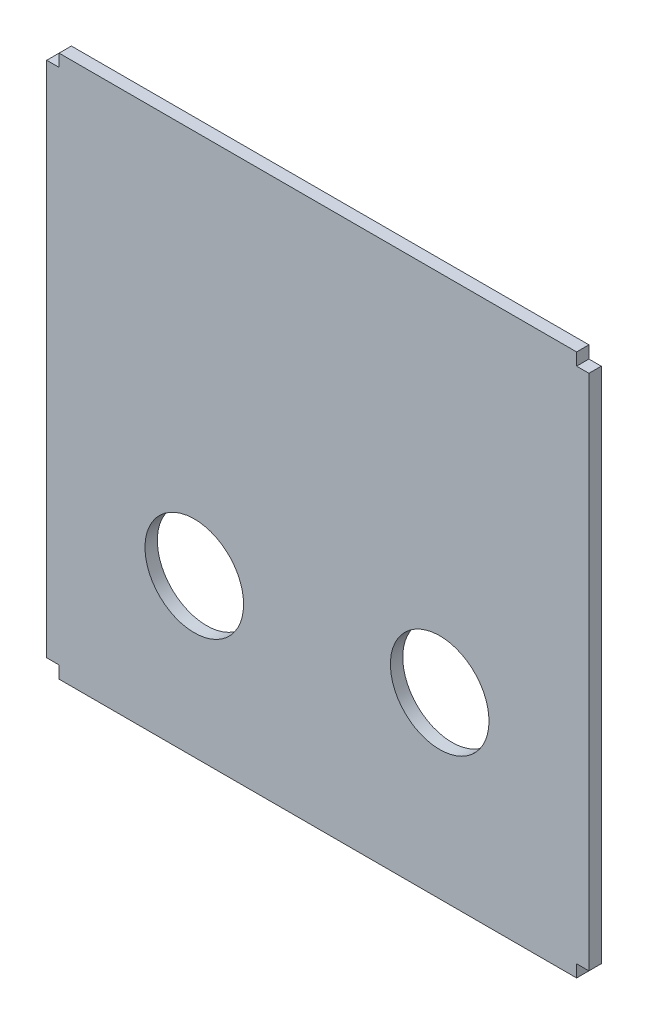
ISO-10303-21;
HEADER;
FILE_DESCRIPTION(('STEP AP214'),'2;1');
FILE_NAME('part.step','',(''),(''),'','','');
FILE_SCHEMA(('AUTOMOTIVE_DESIGN { 1 0 10303 214 1 1 1 1 }'));
ENDSEC;
DATA;
#1=APPLICATION_CONTEXT('core data for automotive mechanical design processes');
#2=APPLICATION_PROTOCOL_DEFINITION('international standard','automotive_design',2000,#1);
#3=PRODUCT_CONTEXT('',#1,'mechanical');
#4=PRODUCT('Part','Part','',(#3));
#5=PRODUCT_RELATED_PRODUCT_CATEGORY('part','',(#4));
#6=PRODUCT_DEFINITION_FORMATION('','',#4);
#7=PRODUCT_DEFINITION_CONTEXT('part definition',#1,'design');
#8=PRODUCT_DEFINITION('design','',#6,#7);
#9=PRODUCT_DEFINITION_SHAPE('','',#8);
#10=(LENGTH_UNIT() NAMED_UNIT(*) SI_UNIT(.MILLI.,.METRE.));
#11=(NAMED_UNIT(*) PLANE_ANGLE_UNIT() SI_UNIT($,.RADIAN.));
#12=(NAMED_UNIT(*) SI_UNIT($,.STERADIAN.) SOLID_ANGLE_UNIT());
#13=UNCERTAINTY_MEASURE_WITH_UNIT(LENGTH_MEASURE(1.E-05),#10,'distance_accuracy_value','');
#14=(GEOMETRIC_REPRESENTATION_CONTEXT(3) GLOBAL_UNCERTAINTY_ASSIGNED_CONTEXT((#13)) GLOBAL_UNIT_ASSIGNED_CONTEXT((#10,
#11,#12)) REPRESENTATION_CONTEXT('',''));
#15=CARTESIAN_POINT('',(0.,0.,0.));
#16=DIRECTION('',(0.,0.,1.));
#17=DIRECTION('',(1.,0.,0.));
#18=AXIS2_PLACEMENT_3D('',#15,#16,#17);
#19=CARTESIAN_POINT('',(139.7,-139.7,6.35));
#20=DIRECTION('',(-1.,0.,0.));
#21=DIRECTION('',(0.,0.,1.));
#22=AXIS2_PLACEMENT_3D('',#19,#20,#21);
#23=PLANE('',#22);
#24=DIRECTION('',(0.,1.,0.));
#25=VECTOR('',#24,1.);
#26=CARTESIAN_POINT('',(139.7,-139.7,6.35));
#27=LINE('',#26,#25);
#28=CARTESIAN_POINT('',(139.7,-133.35,6.35));
#29=VERTEX_POINT('',#28);
#30=CARTESIAN_POINT('',(139.7,133.35,6.35));
#31=VERTEX_POINT('',#30);
#32=EDGE_CURVE('E161',#29,#31,#27,.T.);
#33=ORIENTED_EDGE('',*,*,#32,.F.);
#34=DIRECTION('',(0.,0.,1.));
#35=VECTOR('',#34,1.);
#36=CARTESIAN_POINT('',(139.7,-133.35,0.));
#37=LINE('',#36,#35);
#38=CARTESIAN_POINT('',(139.7,-133.35,0.));
#39=VERTEX_POINT('',#38);
#40=EDGE_CURVE('E207',#39,#29,#37,.T.);
#41=ORIENTED_EDGE('',*,*,#40,.F.);
#42=DIRECTION('',(0.,1.,0.));
#43=VECTOR('',#42,1.);
#44=CARTESIAN_POINT('',(139.7,-139.7,0.));
#45=LINE('',#44,#43);
#46=CARTESIAN_POINT('',(139.7,133.35,0.));
#47=VERTEX_POINT('',#46);
#48=EDGE_CURVE('E151',#39,#47,#45,.T.);
#49=ORIENTED_EDGE('',*,*,#48,.T.);
#50=DIRECTION('',(0.,0.,1.));
#51=VECTOR('',#50,1.);
#52=CARTESIAN_POINT('',(139.7,133.35,0.));
#53=LINE('',#52,#51);
#54=EDGE_CURVE('E187',#47,#31,#53,.T.);
#55=ORIENTED_EDGE('',*,*,#54,.T.);
#56=EDGE_LOOP('',(#33,#41,#49,#55));
#57=FACE_BOUND('',#56,.T.);
#58=ADVANCED_FACE('F33',(#57),#23,.F.);
#59=CARTESIAN_POINT('',(-139.7,139.7,6.35));
#60=DIRECTION('',(0.,-1.,0.));
#61=DIRECTION('',(0.,0.,-1.));
#62=AXIS2_PLACEMENT_3D('',#59,#60,#61);
#63=PLANE('',#62);
#64=DIRECTION('',(-1.,0.,0.));
#65=VECTOR('',#64,1.);
#66=CARTESIAN_POINT('',(-139.7,139.7,6.35));
#67=LINE('',#66,#65);
#68=CARTESIAN_POINT('',(133.35,139.7,6.35));
#69=VERTEX_POINT('',#68);
#70=CARTESIAN_POINT('',(-133.35,139.7,6.35));
#71=VERTEX_POINT('',#70);
#72=EDGE_CURVE('E143',#69,#71,#67,.T.);
#73=ORIENTED_EDGE('',*,*,#72,.F.);
#74=DIRECTION('',(0.,0.,1.));
#75=VECTOR('',#74,1.);
#76=CARTESIAN_POINT('',(133.35,139.7,0.));
#77=LINE('',#76,#75);
#78=CARTESIAN_POINT('',(133.35,139.7,0.));
#79=VERTEX_POINT('',#78);
#80=EDGE_CURVE('E127',#79,#69,#77,.T.);
#81=ORIENTED_EDGE('',*,*,#80,.F.);
#82=DIRECTION('',(-1.,0.,0.));
#83=VECTOR('',#82,1.);
#84=CARTESIAN_POINT('',(-139.7,139.7,0.));
#85=LINE('',#84,#83);
#86=CARTESIAN_POINT('',(-133.35,139.7,0.));
#87=VERTEX_POINT('',#86);
#88=EDGE_CURVE('E141',#79,#87,#85,.T.);
#89=ORIENTED_EDGE('',*,*,#88,.T.);
#90=DIRECTION('',(0.,0.,1.));
#91=VECTOR('',#90,1.);
#92=CARTESIAN_POINT('',(-133.35,139.7,0.));
#93=LINE('',#92,#91);
#94=EDGE_CURVE('E168',#87,#71,#93,.T.);
#95=ORIENTED_EDGE('',*,*,#94,.T.);
#96=EDGE_LOOP('',(#73,#81,#89,#95));
#97=FACE_BOUND('',#96,.T.);
#98=ADVANCED_FACE('F139',(#97),#63,.F.);
#99=CARTESIAN_POINT('',(-139.7,-139.7,6.35));
#100=DIRECTION('',(1.,0.,0.));
#101=DIRECTION('',(0.,0.,-1.));
#102=AXIS2_PLACEMENT_3D('',#99,#100,#101);
#103=PLANE('',#102);
#104=DIRECTION('',(0.,-1.,0.));
#105=VECTOR('',#104,1.);
#106=CARTESIAN_POINT('',(-139.7,-139.7,0.));
#107=LINE('',#106,#105);
#108=CARTESIAN_POINT('',(-139.7,133.35,0.));
#109=VERTEX_POINT('',#108);
#110=CARTESIAN_POINT('',(-139.7,-133.35,0.));
#111=VERTEX_POINT('',#110);
#112=EDGE_CURVE('E150',#109,#111,#107,.T.);
#113=ORIENTED_EDGE('',*,*,#112,.T.);
#114=DIRECTION('',(0.,0.,1.));
#115=VECTOR('',#114,1.);
#116=CARTESIAN_POINT('',(-139.7,-133.35,0.));
#117=LINE('',#116,#115);
#118=CARTESIAN_POINT('',(-139.7,-133.35,6.35));
#119=VERTEX_POINT('',#118);
#120=EDGE_CURVE('E194',#111,#119,#117,.T.);
#121=ORIENTED_EDGE('',*,*,#120,.T.);
#122=DIRECTION('',(0.,-1.,0.));
#123=VECTOR('',#122,1.);
#124=CARTESIAN_POINT('',(-139.7,-139.7,6.35));
#125=LINE('',#124,#123);
#126=CARTESIAN_POINT('',(-139.7,133.35,6.35));
#127=VERTEX_POINT('',#126);
#128=EDGE_CURVE('E41',#127,#119,#125,.T.);
#129=ORIENTED_EDGE('',*,*,#128,.F.);
#130=DIRECTION('',(0.,0.,1.));
#131=VECTOR('',#130,1.);
#132=CARTESIAN_POINT('',(-139.7,133.35,0.));
#133=LINE('',#132,#131);
#134=EDGE_CURVE('E176',#109,#127,#133,.T.);
#135=ORIENTED_EDGE('',*,*,#134,.F.);
#136=EDGE_LOOP('',(#113,#121,#129,#135));
#137=FACE_BOUND('',#136,.T.);
#138=ADVANCED_FACE('F255',(#137),#103,.F.);
#139=CARTESIAN_POINT('',(-139.7,-139.7,6.35));
#140=DIRECTION('',(0.,1.,0.));
#141=DIRECTION('',(0.,0.,1.));
#142=AXIS2_PLACEMENT_3D('',#139,#140,#141);
#143=PLANE('',#142);
#144=DIRECTION('',(1.,0.,0.));
#145=VECTOR('',#144,1.);
#146=CARTESIAN_POINT('',(-139.7,-139.7,6.35));
#147=LINE('',#146,#145);
#148=CARTESIAN_POINT('',(-133.35,-139.7,6.35));
#149=VERTEX_POINT('',#148);
#150=CARTESIAN_POINT('',(133.35,-139.7,6.35));
#151=VERTEX_POINT('',#150);
#152=EDGE_CURVE('E11',#149,#151,#147,.T.);
#153=ORIENTED_EDGE('',*,*,#152,.F.);
#154=DIRECTION('',(0.,0.,1.));
#155=VECTOR('',#154,1.);
#156=CARTESIAN_POINT('',(-133.35,-139.7,0.));
#157=LINE('',#156,#155);
#158=CARTESIAN_POINT('',(-133.35,-139.7,0.));
#159=VERTEX_POINT('',#158);
#160=EDGE_CURVE('E190',#159,#149,#157,.T.);
#161=ORIENTED_EDGE('',*,*,#160,.F.);
#162=DIRECTION('',(1.,0.,0.));
#163=VECTOR('',#162,1.);
#164=CARTESIAN_POINT('',(-139.7,-139.7,0.));
#165=LINE('',#164,#163);
#166=CARTESIAN_POINT('',(133.35,-139.7,0.));
#167=VERTEX_POINT('',#166);
#168=EDGE_CURVE('E36',#159,#167,#165,.T.);
#169=ORIENTED_EDGE('',*,*,#168,.T.);
#170=DIRECTION('',(0.,0.,1.));
#171=VECTOR('',#170,1.);
#172=CARTESIAN_POINT('',(133.35,-139.7,0.));
#173=LINE('',#172,#171);
#174=EDGE_CURVE('E211',#167,#151,#173,.T.);
#175=ORIENTED_EDGE('',*,*,#174,.T.);
#176=EDGE_LOOP('',(#153,#161,#169,#175));
#177=FACE_BOUND('',#176,.T.);
#178=ADVANCED_FACE('F245',(#177),#143,.F.);
#179=CARTESIAN_POINT('',(0.,0.,6.35));
#180=DIRECTION('',(0.,0.,-1.));
#181=DIRECTION('',(-1.,0.,0.));
#182=AXIS2_PLACEMENT_3D('',#179,#180,#181);
#183=PLANE('',#182);
#184=CARTESIAN_POINT('',(-63.6689867874865,-58.7375000000001,6.35));
#185=DIRECTION('',(0.,0.,1.));
#186=DIRECTION('',(1.,0.,0.));
#187=AXIS2_PLACEMENT_3D('',#184,#185,#186);
#188=CIRCLE('',#187,25.4);
#189=CARTESIAN_POINT('',(-38.2689867874865,-58.7375000000001,6.35));
#190=VERTEX_POINT('',#189);
#191=EDGE_CURVE('E171',#190,#190,#188,.T.);
#192=ORIENTED_EDGE('',*,*,#191,.F.);
#193=EDGE_LOOP('',(#192));
#194=FACE_BOUND('',#193,.T.);
#195=CARTESIAN_POINT('',(62.7972915434112,-47.6249999999954,6.35));
#196=DIRECTION('',(0.,0.,1.));
#197=DIRECTION('',(1.,0.,0.));
#198=AXIS2_PLACEMENT_3D('',#195,#196,#197);
#199=CIRCLE('',#198,25.4000000000008);
#200=CARTESIAN_POINT('',(88.197291543412,-47.6249999999954,6.35));
#201=VERTEX_POINT('',#200);
#202=EDGE_CURVE('E164',#201,#201,#199,.T.);
#203=ORIENTED_EDGE('',*,*,#202,.F.);
#204=EDGE_LOOP('',(#203));
#205=FACE_BOUND('',#204,.T.);
#206=ORIENTED_EDGE('',*,*,#128,.T.);
#207=DIRECTION('',(-1.,0.,0.));
#208=VECTOR('',#207,1.);
#209=CARTESIAN_POINT('',(-139.7,-133.35,6.35));
#210=LINE('',#209,#208);
#211=CARTESIAN_POINT('',(-133.35,-133.35,6.35));
#212=VERTEX_POINT('',#211);
#213=EDGE_CURVE('E198',#212,#119,#210,.T.);
#214=ORIENTED_EDGE('',*,*,#213,.F.);
#215=DIRECTION('',(0.,1.,0.));
#216=VECTOR('',#215,1.);
#217=CARTESIAN_POINT('',(-133.35,-139.7,6.35));
#218=LINE('',#217,#216);
#219=EDGE_CURVE('E201',#149,#212,#218,.T.);
#220=ORIENTED_EDGE('',*,*,#219,.F.);
#221=ORIENTED_EDGE('',*,*,#152,.T.);
#222=DIRECTION('',(0.,-1.,0.));
#223=VECTOR('',#222,1.);
#224=CARTESIAN_POINT('',(133.35,-139.7,6.35));
#225=LINE('',#224,#223);
#226=CARTESIAN_POINT('',(133.35,-133.35,6.35));
#227=VERTEX_POINT('',#226);
#228=EDGE_CURVE('E215',#227,#151,#225,.T.);
#229=ORIENTED_EDGE('',*,*,#228,.F.);
#230=DIRECTION('',(-1.,0.,0.));
#231=VECTOR('',#230,1.);
#232=CARTESIAN_POINT('',(139.7,-133.35,6.35));
#233=LINE('',#232,#231);
#234=EDGE_CURVE('E197',#29,#227,#233,.T.);
#235=ORIENTED_EDGE('',*,*,#234,.F.);
#236=ORIENTED_EDGE('',*,*,#32,.T.);
#237=DIRECTION('',(1.,0.,0.));
#238=VECTOR('',#237,1.);
#239=CARTESIAN_POINT('',(139.7,133.35,6.35));
#240=LINE('',#239,#238);
#241=CARTESIAN_POINT('',(133.35,133.35,6.35));
#242=VERTEX_POINT('',#241);
#243=EDGE_CURVE('E134',#242,#31,#240,.T.);
#244=ORIENTED_EDGE('',*,*,#243,.F.);
#245=DIRECTION('',(0.,-1.,0.));
#246=VECTOR('',#245,1.);
#247=CARTESIAN_POINT('',(133.35,139.7,6.35));
#248=LINE('',#247,#246);
#249=EDGE_CURVE('E214',#69,#242,#248,.T.);
#250=ORIENTED_EDGE('',*,*,#249,.F.);
#251=ORIENTED_EDGE('',*,*,#72,.T.);
#252=DIRECTION('',(0.,1.,0.));
#253=VECTOR('',#252,1.);
#254=CARTESIAN_POINT('',(-133.35,139.7,6.35));
#255=LINE('',#254,#253);
#256=CARTESIAN_POINT('',(-133.35,133.35,6.35));
#257=VERTEX_POINT('',#256);
#258=EDGE_CURVE('E181',#257,#71,#255,.T.);
#259=ORIENTED_EDGE('',*,*,#258,.F.);
#260=DIRECTION('',(1.,0.,0.));
#261=VECTOR('',#260,1.);
#262=CARTESIAN_POINT('',(-139.7,133.35,6.35));
#263=LINE('',#262,#261);
#264=EDGE_CURVE('E184',#127,#257,#263,.T.);
#265=ORIENTED_EDGE('',*,*,#264,.F.);
#266=EDGE_LOOP('',(#206,#214,#220,#221,#229,#235,#236,#244,#250,#251,#259,#265));
#267=FACE_BOUND('',#266,.T.);
#268=ADVANCED_FACE('F238',(#194,#205,#267),#183,.F.);
#269=CARTESIAN_POINT('',(0.,0.,0.));
#270=DIRECTION('',(0.,0.,-1.));
#271=DIRECTION('',(-1.,0.,0.));
#272=AXIS2_PLACEMENT_3D('',#269,#270,#271);
#273=PLANE('',#272);
#274=DIRECTION('',(-1.,0.,0.));
#275=VECTOR('',#274,1.);
#276=CARTESIAN_POINT('',(-139.7,-133.35,0.));
#277=LINE('',#276,#275);
#278=CARTESIAN_POINT('',(-133.35,-133.35,0.));
#279=VERTEX_POINT('',#278);
#280=EDGE_CURVE('E49',#279,#111,#277,.T.);
#281=ORIENTED_EDGE('',*,*,#280,.T.);
#282=ORIENTED_EDGE('',*,*,#112,.F.);
#283=DIRECTION('',(1.,0.,0.));
#284=VECTOR('',#283,1.);
#285=CARTESIAN_POINT('',(-139.7,133.35,0.));
#286=LINE('',#285,#284);
#287=CARTESIAN_POINT('',(-133.35,133.35,0.));
#288=VERTEX_POINT('',#287);
#289=EDGE_CURVE('E183',#109,#288,#286,.T.);
#290=ORIENTED_EDGE('',*,*,#289,.T.);
#291=DIRECTION('',(0.,1.,0.));
#292=VECTOR('',#291,1.);
#293=CARTESIAN_POINT('',(-133.35,139.7,0.));
#294=LINE('',#293,#292);
#295=EDGE_CURVE('E149',#288,#87,#294,.T.);
#296=ORIENTED_EDGE('',*,*,#295,.T.);
#297=ORIENTED_EDGE('',*,*,#88,.F.);
#298=DIRECTION('',(0.,-1.,0.));
#299=VECTOR('',#298,1.);
#300=CARTESIAN_POINT('',(133.35,139.7,0.));
#301=LINE('',#300,#299);
#302=CARTESIAN_POINT('',(133.35,133.35,0.));
#303=VERTEX_POINT('',#302);
#304=EDGE_CURVE('E123',#79,#303,#301,.T.);
#305=ORIENTED_EDGE('',*,*,#304,.T.);
#306=DIRECTION('',(1.,0.,0.));
#307=VECTOR('',#306,1.);
#308=CARTESIAN_POINT('',(139.7,133.35,0.));
#309=LINE('',#308,#307);
#310=EDGE_CURVE('E133',#303,#47,#309,.T.);
#311=ORIENTED_EDGE('',*,*,#310,.T.);
#312=ORIENTED_EDGE('',*,*,#48,.F.);
#313=DIRECTION('',(-1.,0.,0.));
#314=VECTOR('',#313,1.);
#315=CARTESIAN_POINT('',(139.7,-133.35,0.));
#316=LINE('',#315,#314);
#317=CARTESIAN_POINT('',(133.35,-133.35,0.));
#318=VERTEX_POINT('',#317);
#319=EDGE_CURVE('E217',#39,#318,#316,.T.);
#320=ORIENTED_EDGE('',*,*,#319,.T.);
#321=DIRECTION('',(0.,-1.,0.));
#322=VECTOR('',#321,1.);
#323=CARTESIAN_POINT('',(133.35,-139.7,0.));
#324=LINE('',#323,#322);
#325=EDGE_CURVE('E57',#318,#167,#324,.T.);
#326=ORIENTED_EDGE('',*,*,#325,.T.);
#327=ORIENTED_EDGE('',*,*,#168,.F.);
#328=DIRECTION('',(0.,1.,0.));
#329=VECTOR('',#328,1.);
#330=CARTESIAN_POINT('',(-133.35,-139.7,0.));
#331=LINE('',#330,#329);
#332=EDGE_CURVE('E200',#159,#279,#331,.T.);
#333=ORIENTED_EDGE('',*,*,#332,.T.);
#334=EDGE_LOOP('',(#281,#282,#290,#296,#297,#305,#311,#312,#320,#326,#327,#333));
#335=FACE_BOUND('',#334,.T.);
#336=CARTESIAN_POINT('',(-63.6689867874865,-58.7375000000001,0.));
#337=DIRECTION('',(0.,0.,1.));
#338=DIRECTION('',(1.,0.,0.));
#339=AXIS2_PLACEMENT_3D('',#336,#337,#338);
#340=CIRCLE('',#339,25.4);
#341=CARTESIAN_POINT('',(-38.2689867874865,-58.7375000000001,0.));
#342=VERTEX_POINT('',#341);
#343=EDGE_CURVE('E155',#342,#342,#340,.T.);
#344=ORIENTED_EDGE('',*,*,#343,.T.);
#345=EDGE_LOOP('',(#344));
#346=FACE_BOUND('',#345,.T.);
#347=CARTESIAN_POINT('',(62.7972915434112,-47.6249999999954,0.));
#348=DIRECTION('',(0.,0.,1.));
#349=DIRECTION('',(1.,0.,0.));
#350=AXIS2_PLACEMENT_3D('',#347,#348,#349);
#351=CIRCLE('',#350,25.4000000000008);
#352=CARTESIAN_POINT('',(88.197291543412,-47.6249999999954,0.));
#353=VERTEX_POINT('',#352);
#354=EDGE_CURVE('E167',#353,#353,#351,.T.);
#355=ORIENTED_EDGE('',*,*,#354,.T.);
#356=EDGE_LOOP('',(#355));
#357=FACE_BOUND('',#356,.T.);
#358=ADVANCED_FACE('F146',(#335,#346,#357),#273,.T.);
#359=CARTESIAN_POINT('',(62.7972915434112,-47.6249999999954,0.));
#360=DIRECTION('',(0.,0.,1.));
#361=DIRECTION('',(1.,0.,0.));
#362=AXIS2_PLACEMENT_3D('',#359,#360,#361);
#363=CYLINDRICAL_SURFACE('',#362,25.4000000000008);
#364=ORIENTED_EDGE('',*,*,#354,.F.);
#365=EDGE_LOOP('',(#364));
#366=FACE_BOUND('',#365,.T.);
#367=ORIENTED_EDGE('',*,*,#202,.T.);
#368=EDGE_LOOP('',(#367));
#369=FACE_BOUND('',#368,.T.);
#370=ADVANCED_FACE('F287',(#366,#369),#363,.F.);
#371=CARTESIAN_POINT('',(-63.6689867874865,-58.7375000000001,0.));
#372=DIRECTION('',(0.,0.,1.));
#373=DIRECTION('',(1.,0.,0.));
#374=AXIS2_PLACEMENT_3D('',#371,#372,#373);
#375=CYLINDRICAL_SURFACE('',#374,25.4);
#376=ORIENTED_EDGE('',*,*,#343,.F.);
#377=EDGE_LOOP('',(#376));
#378=FACE_BOUND('',#377,.T.);
#379=ORIENTED_EDGE('',*,*,#191,.T.);
#380=EDGE_LOOP('',(#379));
#381=FACE_BOUND('',#380,.T.);
#382=ADVANCED_FACE('F293',(#378,#381),#375,.F.);
#383=CARTESIAN_POINT('',(-133.35,139.7,0.));
#384=DIRECTION('',(1.,0.,0.));
#385=DIRECTION('',(0.,1.,0.));
#386=AXIS2_PLACEMENT_3D('',#383,#384,#385);
#387=PLANE('',#386);
#388=ORIENTED_EDGE('',*,*,#258,.T.);
#389=ORIENTED_EDGE('',*,*,#94,.F.);
#390=ORIENTED_EDGE('',*,*,#295,.F.);
#391=DIRECTION('',(0.,0.,1.));
#392=VECTOR('',#391,1.);
#393=CARTESIAN_POINT('',(-133.35,133.35,0.));
#394=LINE('',#393,#392);
#395=EDGE_CURVE('E178',#288,#257,#394,.T.);
#396=ORIENTED_EDGE('',*,*,#395,.T.);
#397=EDGE_LOOP('',(#388,#389,#390,#396));
#398=FACE_BOUND('',#397,.T.);
#399=ADVANCED_FACE('F263',(#398),#387,.F.);
#400=CARTESIAN_POINT('',(-139.7,133.35,0.));
#401=DIRECTION('',(0.,-1.,0.));
#402=DIRECTION('',(0.,0.,-1.));
#403=AXIS2_PLACEMENT_3D('',#400,#401,#402);
#404=PLANE('',#403);
#405=ORIENTED_EDGE('',*,*,#264,.T.);
#406=ORIENTED_EDGE('',*,*,#395,.F.);
#407=ORIENTED_EDGE('',*,*,#289,.F.);
#408=ORIENTED_EDGE('',*,*,#134,.T.);
#409=EDGE_LOOP('',(#405,#406,#407,#408));
#410=FACE_BOUND('',#409,.T.);
#411=ADVANCED_FACE('F261',(#410),#404,.F.);
#412=CARTESIAN_POINT('',(139.7,133.35,0.));
#413=DIRECTION('',(0.,-1.,0.));
#414=DIRECTION('',(0.,0.,-1.));
#415=AXIS2_PLACEMENT_3D('',#412,#413,#414);
#416=PLANE('',#415);
#417=ORIENTED_EDGE('',*,*,#243,.T.);
#418=ORIENTED_EDGE('',*,*,#54,.F.);
#419=ORIENTED_EDGE('',*,*,#310,.F.);
#420=DIRECTION('',(0.,0.,1.));
#421=VECTOR('',#420,1.);
#422=CARTESIAN_POINT('',(133.35,133.35,0.));
#423=LINE('',#422,#421);
#424=EDGE_CURVE('E129',#303,#242,#423,.T.);
#425=ORIENTED_EDGE('',*,*,#424,.T.);
#426=EDGE_LOOP('',(#417,#418,#419,#425));
#427=FACE_BOUND('',#426,.T.);
#428=ADVANCED_FACE('F264',(#427),#416,.F.);
#429=CARTESIAN_POINT('',(133.35,139.7,0.));
#430=DIRECTION('',(-1.,0.,0.));
#431=DIRECTION('',(0.,-1.,0.));
#432=AXIS2_PLACEMENT_3D('',#429,#430,#431);
#433=PLANE('',#432);
#434=ORIENTED_EDGE('',*,*,#249,.T.);
#435=ORIENTED_EDGE('',*,*,#424,.F.);
#436=ORIENTED_EDGE('',*,*,#304,.F.);
#437=ORIENTED_EDGE('',*,*,#80,.T.);
#438=EDGE_LOOP('',(#434,#435,#436,#437));
#439=FACE_BOUND('',#438,.T.);
#440=ADVANCED_FACE('F126',(#439),#433,.F.);
#441=CARTESIAN_POINT('',(133.35,-139.7,0.));
#442=DIRECTION('',(-1.,0.,0.));
#443=DIRECTION('',(0.,0.,1.));
#444=AXIS2_PLACEMENT_3D('',#441,#442,#443);
#445=PLANE('',#444);
#446=ORIENTED_EDGE('',*,*,#228,.T.);
#447=ORIENTED_EDGE('',*,*,#174,.F.);
#448=ORIENTED_EDGE('',*,*,#325,.F.);
#449=DIRECTION('',(0.,0.,1.));
#450=VECTOR('',#449,1.);
#451=CARTESIAN_POINT('',(133.35,-133.35,0.));
#452=LINE('',#451,#450);
#453=EDGE_CURVE('E209',#318,#227,#452,.T.);
#454=ORIENTED_EDGE('',*,*,#453,.T.);
#455=EDGE_LOOP('',(#446,#447,#448,#454));
#456=FACE_BOUND('',#455,.T.);
#457=ADVANCED_FACE('F242',(#456),#445,.F.);
#458=CARTESIAN_POINT('',(139.7,-133.35,0.));
#459=DIRECTION('',(0.,1.,0.));
#460=DIRECTION('',(0.,0.,1.));
#461=AXIS2_PLACEMENT_3D('',#458,#459,#460);
#462=PLANE('',#461);
#463=ORIENTED_EDGE('',*,*,#234,.T.);
#464=ORIENTED_EDGE('',*,*,#453,.F.);
#465=ORIENTED_EDGE('',*,*,#319,.F.);
#466=ORIENTED_EDGE('',*,*,#40,.T.);
#467=EDGE_LOOP('',(#463,#464,#465,#466));
#468=FACE_BOUND('',#467,.T.);
#469=ADVANCED_FACE('F235',(#468),#462,.F.);
#470=CARTESIAN_POINT('',(-139.7,-133.35,0.));
#471=DIRECTION('',(0.,1.,0.));
#472=DIRECTION('',(0.,0.,1.));
#473=AXIS2_PLACEMENT_3D('',#470,#471,#472);
#474=PLANE('',#473);
#475=ORIENTED_EDGE('',*,*,#213,.T.);
#476=ORIENTED_EDGE('',*,*,#120,.F.);
#477=ORIENTED_EDGE('',*,*,#280,.F.);
#478=DIRECTION('',(0.,0.,1.));
#479=VECTOR('',#478,1.);
#480=CARTESIAN_POINT('',(-133.35,-133.35,0.));
#481=LINE('',#480,#479);
#482=EDGE_CURVE('E192',#279,#212,#481,.T.);
#483=ORIENTED_EDGE('',*,*,#482,.T.);
#484=EDGE_LOOP('',(#475,#476,#477,#483));
#485=FACE_BOUND('',#484,.T.);
#486=ADVANCED_FACE('F252',(#485),#474,.F.);
#487=CARTESIAN_POINT('',(-133.35,-139.7,0.));
#488=DIRECTION('',(1.,0.,0.));
#489=DIRECTION('',(0.,0.,-1.));
#490=AXIS2_PLACEMENT_3D('',#487,#488,#489);
#491=PLANE('',#490);
#492=ORIENTED_EDGE('',*,*,#219,.T.);
#493=ORIENTED_EDGE('',*,*,#482,.F.);
#494=ORIENTED_EDGE('',*,*,#332,.F.);
#495=ORIENTED_EDGE('',*,*,#160,.T.);
#496=EDGE_LOOP('',(#492,#493,#494,#495));
#497=FACE_BOUND('',#496,.T.);
#498=ADVANCED_FACE('F250',(#497),#491,.F.);
#499=CLOSED_SHELL('',(#58,#98,#138,#178,#268,#358,#370,#382,#399,#411,#428,#440,#457,#469,#486,#498));
#500=MANIFOLD_SOLID_BREP('B2',#499);
#501=ADVANCED_BREP_SHAPE_REPRESENTATION('',(#18,#500),#14);
#502=SHAPE_DEFINITION_REPRESENTATION(#9,#501);
ENDSEC;
END-ISO-10303-21;
